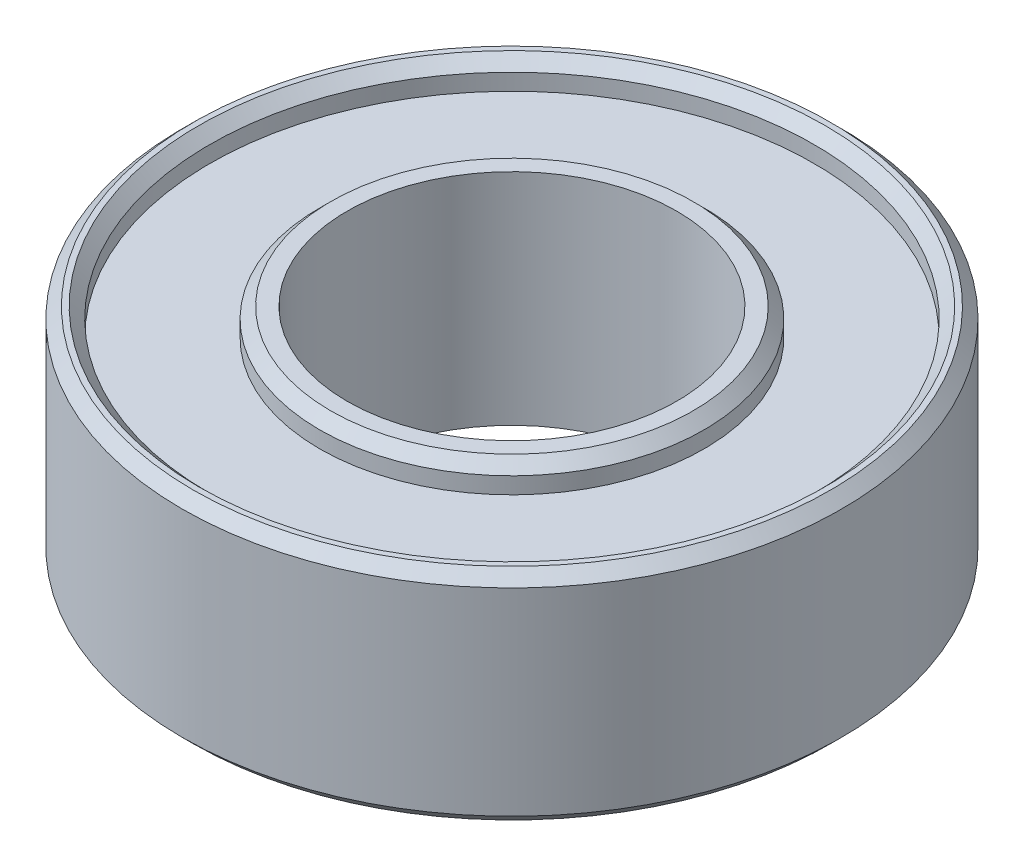
ISO-10303-21;
HEADER;
FILE_DESCRIPTION(('STEP AP214'),'2;1');
FILE_NAME('part.step','',(''),(''),'','','');
FILE_SCHEMA(('AUTOMOTIVE_DESIGN { 1 0 10303 214 1 1 1 1 }'));
ENDSEC;
DATA;
#1=APPLICATION_CONTEXT('core data for automotive mechanical design processes');
#2=APPLICATION_PROTOCOL_DEFINITION('international standard','automotive_design',2000,#1);
#3=PRODUCT_CONTEXT('',#1,'mechanical');
#4=PRODUCT('Part','Part','',(#3));
#5=PRODUCT_RELATED_PRODUCT_CATEGORY('part','',(#4));
#6=PRODUCT_DEFINITION_FORMATION('','',#4);
#7=PRODUCT_DEFINITION_CONTEXT('part definition',#1,'design');
#8=PRODUCT_DEFINITION('design','',#6,#7);
#9=PRODUCT_DEFINITION_SHAPE('','',#8);
#10=(LENGTH_UNIT() NAMED_UNIT(*) SI_UNIT(.MILLI.,.METRE.));
#11=(NAMED_UNIT(*) PLANE_ANGLE_UNIT() SI_UNIT($,.RADIAN.));
#12=(NAMED_UNIT(*) SI_UNIT($,.STERADIAN.) SOLID_ANGLE_UNIT());
#13=UNCERTAINTY_MEASURE_WITH_UNIT(LENGTH_MEASURE(1.E-05),#10,'distance_accuracy_value','');
#14=(GEOMETRIC_REPRESENTATION_CONTEXT(3) GLOBAL_UNCERTAINTY_ASSIGNED_CONTEXT((#13)) GLOBAL_UNIT_ASSIGNED_CONTEXT((#10,
#11,#12)) REPRESENTATION_CONTEXT('',''));
#15=CARTESIAN_POINT('',(0.,0.,0.));
#16=DIRECTION('',(0.,0.,1.));
#17=DIRECTION('',(1.,0.,0.));
#18=AXIS2_PLACEMENT_3D('',#15,#16,#17);
#19=CARTESIAN_POINT('',(0.,0.,0.));
#20=DIRECTION('',(0.,1.,0.));
#21=DIRECTION('',(0.,0.,1.));
#22=AXIS2_PLACEMENT_3D('',#19,#20,#21);
#23=PLANE('',#22);
#24=CARTESIAN_POINT('',(0.,0.,0.));
#25=DIRECTION('',(0.,1.,0.));
#26=DIRECTION('',(0.,0.,1.));
#27=AXIS2_PLACEMENT_3D('',#24,#25,#26);
#28=CIRCLE('',#27,1.65);
#29=CARTESIAN_POINT('',(0.,0.,1.65));
#30=VERTEX_POINT('',#29);
#31=EDGE_CURVE('E78',#30,#30,#28,.F.);
#32=ORIENTED_EDGE('',*,*,#31,.T.);
#33=EDGE_LOOP('',(#32));
#34=FACE_BOUND('',#33,.T.);
#35=CARTESIAN_POINT('',(0.,0.,0.));
#36=DIRECTION('',(0.,1.,0.));
#37=DIRECTION('',(0.,0.,1.));
#38=AXIS2_PLACEMENT_3D('',#35,#36,#37);
#39=CIRCLE('',#38,1.5);
#40=CARTESIAN_POINT('',(0.,0.,1.5));
#41=VERTEX_POINT('',#40);
#42=EDGE_CURVE('E93',#41,#41,#39,.T.);
#43=ORIENTED_EDGE('',*,*,#42,.T.);
#44=EDGE_LOOP('',(#43));
#45=FACE_BOUND('',#44,.T.);
#46=ADVANCED_FACE('F45',(#34,#45),#23,.F.);
#47=CARTESIAN_POINT('',(0.,2.,0.));
#48=DIRECTION('',(0.,1.,0.));
#49=DIRECTION('',(0.,0.,1.));
#50=AXIS2_PLACEMENT_3D('',#47,#48,#49);
#51=PLANE('',#50);
#52=CARTESIAN_POINT('',(0.,2.,0.));
#53=DIRECTION('',(0.,1.,0.));
#54=DIRECTION('',(0.,0.,1.));
#55=AXIS2_PLACEMENT_3D('',#52,#53,#54);
#56=CIRCLE('',#55,1.65);
#57=CARTESIAN_POINT('',(0.,2.,1.65));
#58=VERTEX_POINT('',#57);
#59=EDGE_CURVE('E87',#58,#58,#56,.T.);
#60=ORIENTED_EDGE('',*,*,#59,.T.);
#61=EDGE_LOOP('',(#60));
#62=FACE_BOUND('',#61,.T.);
#63=CARTESIAN_POINT('',(0.,2.,0.));
#64=DIRECTION('',(0.,1.,0.));
#65=DIRECTION('',(0.,0.,1.));
#66=AXIS2_PLACEMENT_3D('',#63,#64,#65);
#67=CIRCLE('',#66,1.5);
#68=CARTESIAN_POINT('',(0.,2.,1.5));
#69=VERTEX_POINT('',#68);
#70=EDGE_CURVE('E90',#69,#69,#67,.T.);
#71=ORIENTED_EDGE('',*,*,#70,.F.);
#72=EDGE_LOOP('',(#71));
#73=FACE_BOUND('',#72,.T.);
#74=ADVANCED_FACE('F128',(#62,#73),#51,.T.);
#75=CARTESIAN_POINT('',(0.,2.,0.));
#76=DIRECTION('',(0.,-1.,0.));
#77=DIRECTION('',(0.,0.,-1.));
#78=AXIS2_PLACEMENT_3D('',#75,#76,#77);
#79=CYLINDRICAL_SURFACE('',#78,3.);
#80=CARTESIAN_POINT('',(0.,0.0999999999999994,0.));
#81=DIRECTION('',(0.,1.,0.));
#82=DIRECTION('',(0.,0.,1.));
#83=AXIS2_PLACEMENT_3D('',#80,#81,#82);
#84=CIRCLE('',#83,3.);
#85=CARTESIAN_POINT('',(0.,0.0999999999999994,3.));
#86=VERTEX_POINT('',#85);
#87=EDGE_CURVE('E61',#86,#86,#84,.T.);
#88=ORIENTED_EDGE('',*,*,#87,.T.);
#89=EDGE_LOOP('',(#88));
#90=FACE_BOUND('',#89,.T.);
#91=CARTESIAN_POINT('',(0.,1.9,0.));
#92=DIRECTION('',(0.,1.,0.));
#93=DIRECTION('',(0.,0.,1.));
#94=AXIS2_PLACEMENT_3D('',#91,#92,#93);
#95=CIRCLE('',#94,3.);
#96=CARTESIAN_POINT('',(0.,1.9,3.));
#97=VERTEX_POINT('',#96);
#98=EDGE_CURVE('E66',#97,#97,#95,.F.);
#99=ORIENTED_EDGE('',*,*,#98,.T.);
#100=EDGE_LOOP('',(#99));
#101=FACE_BOUND('',#100,.T.);
#102=ADVANCED_FACE('F136',(#90,#101),#79,.T.);
#103=CARTESIAN_POINT('',(0.,2.,0.));
#104=DIRECTION('',(0.,1.,0.));
#105=DIRECTION('',(0.,0.,1.));
#106=AXIS2_PLACEMENT_3D('',#103,#104,#105);
#107=CIRCLE('',#106,2.9);
#108=CARTESIAN_POINT('',(0.,2.,2.9));
#109=VERTEX_POINT('',#108);
#110=EDGE_CURVE('E53',#109,#109,#107,.T.);
#111=ORIENTED_EDGE('',*,*,#110,.T.);
#112=EDGE_LOOP('',(#111));
#113=FACE_BOUND('',#112,.T.);
#114=CARTESIAN_POINT('',(0.,2.,0.));
#115=DIRECTION('',(0.,1.,0.));
#116=DIRECTION('',(0.,0.,1.));
#117=AXIS2_PLACEMENT_3D('',#114,#115,#116);
#118=CIRCLE('',#117,2.85);
#119=CARTESIAN_POINT('',(0.,2.,2.85));
#120=VERTEX_POINT('',#119);
#121=EDGE_CURVE('E57',#120,#120,#118,.F.);
#122=ORIENTED_EDGE('',*,*,#121,.T.);
#123=EDGE_LOOP('',(#122));
#124=FACE_BOUND('',#123,.T.);
#125=ADVANCED_FACE('F139',(#113,#124),#51,.T.);
#126=CARTESIAN_POINT('',(0.,0.,0.));
#127=DIRECTION('',(0.,1.,0.));
#128=DIRECTION('',(0.,0.,1.));
#129=AXIS2_PLACEMENT_3D('',#126,#127,#128);
#130=CIRCLE('',#129,2.85);
#131=CARTESIAN_POINT('',(0.,0.,-2.85));
#132=VERTEX_POINT('',#131);
#133=EDGE_CURVE('E72',#132,#132,#130,.T.);
#134=ORIENTED_EDGE('',*,*,#133,.T.);
#135=EDGE_LOOP('',(#134));
#136=FACE_BOUND('',#135,.T.);
#137=CARTESIAN_POINT('',(0.,0.,0.));
#138=DIRECTION('',(0.,1.,0.));
#139=DIRECTION('',(0.,0.,1.));
#140=AXIS2_PLACEMENT_3D('',#137,#138,#139);
#141=CIRCLE('',#140,2.9);
#142=CARTESIAN_POINT('',(0.,0.,2.9));
#143=VERTEX_POINT('',#142);
#144=EDGE_CURVE('E75',#143,#143,#141,.F.);
#145=ORIENTED_EDGE('',*,*,#144,.T.);
#146=EDGE_LOOP('',(#145));
#147=FACE_BOUND('',#146,.T.);
#148=ADVANCED_FACE('F131',(#136,#147),#23,.F.);
#149=CARTESIAN_POINT('',(0.,6.24264068711929,0.));
#150=DIRECTION('',(0.,-1.,0.));
#151=DIRECTION('',(0.,0.,-1.));
#152=AXIS2_PLACEMENT_3D('',#149,#150,#151);
#153=CYLINDRICAL_SURFACE('',#152,1.5);
#154=ORIENTED_EDGE('',*,*,#42,.F.);
#155=EDGE_LOOP('',(#154));
#156=FACE_BOUND('',#155,.T.);
#157=ORIENTED_EDGE('',*,*,#70,.T.);
#158=EDGE_LOOP('',(#157));
#159=FACE_BOUND('',#158,.T.);
#160=ADVANCED_FACE('F143',(#156,#159),#153,.F.);
#161=CARTESIAN_POINT('',(0.,1.75,0.));
#162=DIRECTION('',(0.,1.,0.));
#163=DIRECTION('',(0.,0.,1.));
#164=AXIS2_PLACEMENT_3D('',#161,#162,#163);
#165=CYLINDRICAL_SURFACE('',#164,2.75);
#166=CARTESIAN_POINT('',(0.,1.9,0.));
#167=DIRECTION('',(0.,1.,0.));
#168=DIRECTION('',(0.,0.,1.));
#169=AXIS2_PLACEMENT_3D('',#166,#167,#168);
#170=CIRCLE('',#169,2.75);
#171=CARTESIAN_POINT('',(0.,1.9,2.75));
#172=VERTEX_POINT('',#171);
#173=EDGE_CURVE('E10',#172,#172,#170,.T.);
#174=ORIENTED_EDGE('',*,*,#173,.T.);
#175=EDGE_LOOP('',(#174));
#176=FACE_BOUND('',#175,.T.);
#177=CARTESIAN_POINT('',(0.,1.75,0.));
#178=DIRECTION('',(0.,1.,0.));
#179=DIRECTION('',(0.,0.,1.));
#180=AXIS2_PLACEMENT_3D('',#177,#178,#179);
#181=CIRCLE('',#180,2.75);
#182=CARTESIAN_POINT('',(0.,1.75,2.75));
#183=VERTEX_POINT('',#182);
#184=EDGE_CURVE('E96',#183,#183,#181,.T.);
#185=ORIENTED_EDGE('',*,*,#184,.F.);
#186=EDGE_LOOP('',(#185));
#187=FACE_BOUND('',#186,.T.);
#188=ADVANCED_FACE('F150',(#176,#187),#165,.F.);
#189=CARTESIAN_POINT('',(0.,1.75,0.));
#190=DIRECTION('',(0.,1.,0.));
#191=DIRECTION('',(0.,0.,1.));
#192=AXIS2_PLACEMENT_3D('',#189,#190,#191);
#193=PLANE('',#192);
#194=CARTESIAN_POINT('',(0.,1.75,0.));
#195=DIRECTION('',(0.,1.,0.));
#196=DIRECTION('',(0.,0.,1.));
#197=AXIS2_PLACEMENT_3D('',#194,#195,#196);
#198=CIRCLE('',#197,1.75);
#199=CARTESIAN_POINT('',(0.,1.75,1.75));
#200=VERTEX_POINT('',#199);
#201=EDGE_CURVE('E99',#200,#200,#198,.T.);
#202=ORIENTED_EDGE('',*,*,#201,.F.);
#203=EDGE_LOOP('',(#202));
#204=FACE_BOUND('',#203,.T.);
#205=ORIENTED_EDGE('',*,*,#184,.T.);
#206=EDGE_LOOP('',(#205));
#207=FACE_BOUND('',#206,.T.);
#208=ADVANCED_FACE('F243',(#204,#207),#193,.T.);
#209=CARTESIAN_POINT('',(0.,1.75,0.));
#210=DIRECTION('',(0.,1.,0.));
#211=DIRECTION('',(0.,0.,1.));
#212=AXIS2_PLACEMENT_3D('',#209,#210,#211);
#213=CYLINDRICAL_SURFACE('',#212,1.75);
#214=CARTESIAN_POINT('',(0.,1.9,0.));
#215=DIRECTION('',(0.,1.,0.));
#216=DIRECTION('',(0.,0.,1.));
#217=AXIS2_PLACEMENT_3D('',#214,#215,#216);
#218=CIRCLE('',#217,1.75);
#219=CARTESIAN_POINT('',(0.,1.9,1.75));
#220=VERTEX_POINT('',#219);
#221=EDGE_CURVE('E84',#220,#220,#218,.F.);
#222=ORIENTED_EDGE('',*,*,#221,.T.);
#223=EDGE_LOOP('',(#222));
#224=FACE_BOUND('',#223,.T.);
#225=ORIENTED_EDGE('',*,*,#201,.T.);
#226=EDGE_LOOP('',(#225));
#227=FACE_BOUND('',#226,.T.);
#228=ADVANCED_FACE('F232',(#224,#227),#213,.T.);
#229=CARTESIAN_POINT('',(0.,0.25,0.));
#230=DIRECTION('',(0.,1.,0.));
#231=DIRECTION('',(0.,0.,1.));
#232=AXIS2_PLACEMENT_3D('',#229,#230,#231);
#233=PLANE('',#232);
#234=CARTESIAN_POINT('',(0.,0.25,0.));
#235=DIRECTION('',(0.,1.,0.));
#236=DIRECTION('',(0.,0.,1.));
#237=AXIS2_PLACEMENT_3D('',#234,#235,#236);
#238=CIRCLE('',#237,2.75);
#239=CARTESIAN_POINT('',(0.,0.25,2.75));
#240=VERTEX_POINT('',#239);
#241=EDGE_CURVE('E102',#240,#240,#238,.T.);
#242=ORIENTED_EDGE('',*,*,#241,.F.);
#243=EDGE_LOOP('',(#242));
#244=FACE_BOUND('',#243,.T.);
#245=CARTESIAN_POINT('',(0.,0.25,0.));
#246=DIRECTION('',(0.,1.,0.));
#247=DIRECTION('',(0.,0.,1.));
#248=AXIS2_PLACEMENT_3D('',#245,#246,#247);
#249=CIRCLE('',#248,1.75);
#250=CARTESIAN_POINT('',(0.,0.25,1.75));
#251=VERTEX_POINT('',#250);
#252=EDGE_CURVE('E105',#251,#251,#249,.T.);
#253=ORIENTED_EDGE('',*,*,#252,.T.);
#254=EDGE_LOOP('',(#253));
#255=FACE_BOUND('',#254,.T.);
#256=ADVANCED_FACE('F109',(#244,#255),#233,.F.);
#257=CARTESIAN_POINT('',(0.,0.25,0.));
#258=DIRECTION('',(0.,-1.,0.));
#259=DIRECTION('',(0.,0.,-1.));
#260=AXIS2_PLACEMENT_3D('',#257,#258,#259);
#261=CYLINDRICAL_SURFACE('',#260,2.75);
#262=CARTESIAN_POINT('',(0.,0.0999999999999998,0.));
#263=DIRECTION('',(0.,1.,0.));
#264=DIRECTION('',(0.,0.,1.));
#265=AXIS2_PLACEMENT_3D('',#262,#263,#264);
#266=CIRCLE('',#265,2.75);
#267=CARTESIAN_POINT('',(0.,0.0999999999999998,-2.75));
#268=VERTEX_POINT('',#267);
#269=EDGE_CURVE('E69',#268,#268,#266,.F.);
#270=ORIENTED_EDGE('',*,*,#269,.T.);
#271=EDGE_LOOP('',(#270));
#272=FACE_BOUND('',#271,.T.);
#273=ORIENTED_EDGE('',*,*,#241,.T.);
#274=EDGE_LOOP('',(#273));
#275=FACE_BOUND('',#274,.T.);
#276=ADVANCED_FACE('F114',(#272,#275),#261,.F.);
#277=CARTESIAN_POINT('',(0.,0.25,0.));
#278=DIRECTION('',(0.,-1.,0.));
#279=DIRECTION('',(0.,0.,-1.));
#280=AXIS2_PLACEMENT_3D('',#277,#278,#279);
#281=CYLINDRICAL_SURFACE('',#280,1.75);
#282=CARTESIAN_POINT('',(0.,0.0999999999999996,0.));
#283=DIRECTION('',(0.,1.,0.));
#284=DIRECTION('',(0.,0.,1.));
#285=AXIS2_PLACEMENT_3D('',#282,#283,#284);
#286=CIRCLE('',#285,1.75);
#287=CARTESIAN_POINT('',(0.,0.0999999999999996,1.75));
#288=VERTEX_POINT('',#287);
#289=EDGE_CURVE('E81',#288,#288,#286,.T.);
#290=ORIENTED_EDGE('',*,*,#289,.T.);
#291=EDGE_LOOP('',(#290));
#292=FACE_BOUND('',#291,.T.);
#293=ORIENTED_EDGE('',*,*,#252,.F.);
#294=EDGE_LOOP('',(#293));
#295=FACE_BOUND('',#294,.T.);
#296=ADVANCED_FACE('F111',(#292,#295),#281,.T.);
#297=CARTESIAN_POINT('',(0.,2.,0.));
#298=DIRECTION('',(0.,-1.,0.));
#299=DIRECTION('',(0.,0.,-1.));
#300=AXIS2_PLACEMENT_3D('',#297,#298,#299);
#301=CONICAL_SURFACE('',#300,1.65,0.785398163397445);
#302=ORIENTED_EDGE('',*,*,#221,.F.);
#303=EDGE_LOOP('',(#302));
#304=FACE_BOUND('',#303,.T.);
#305=ORIENTED_EDGE('',*,*,#59,.F.);
#306=EDGE_LOOP('',(#305));
#307=FACE_BOUND('',#306,.T.);
#308=ADVANCED_FACE('F113',(#304,#307),#301,.T.);
#309=CARTESIAN_POINT('',(0.,0.0999999999999996,0.));
#310=DIRECTION('',(0.,1.,0.));
#311=DIRECTION('',(0.,0.,1.));
#312=AXIS2_PLACEMENT_3D('',#309,#310,#311);
#313=CONICAL_SURFACE('',#312,1.75,0.785398163397453);
#314=CARTESIAN_POINT('',(0.,0.,1.65));
#315=CARTESIAN_POINT('',(0.,0.0010416666666666,1.65104166666667));
#316=CARTESIAN_POINT('',(0.,0.00208333333333328,1.65208333333333));
#317=CARTESIAN_POINT('',(0.,0.00416666666666664,1.65416666666667));
#318=CARTESIAN_POINT('',(0.,0.00520833333333332,1.65520833333333));
#319=CARTESIAN_POINT('',(0.,0.00729166666666664,1.65729166666667));
#320=CARTESIAN_POINT('',(0.,0.00833333333333327,1.65833333333333));
#321=CARTESIAN_POINT('',(0.,0.0104166666666666,1.66041666666667));
#322=CARTESIAN_POINT('',(0.,0.0114583333333333,1.66145833333333));
#323=CARTESIAN_POINT('',(0.,0.0135416666666666,1.66354166666667));
#324=CARTESIAN_POINT('',(0.,0.0145833333333333,1.66458333333333));
#325=CARTESIAN_POINT('',(0.,0.0166666666666666,1.66666666666667));
#326=CARTESIAN_POINT('',(0.,0.0177083333333333,1.66770833333333));
#327=CARTESIAN_POINT('',(0.,0.0197916666666666,1.66979166666667));
#328=CARTESIAN_POINT('',(0.,0.0208333333333332,1.67083333333333));
#329=CARTESIAN_POINT('',(0.,0.0229166666666666,1.67291666666667));
#330=CARTESIAN_POINT('',(0.,0.0239583333333332,1.67395833333333));
#331=CARTESIAN_POINT('',(0.,0.0260416666666666,1.67604166666667));
#332=CARTESIAN_POINT('',(0.,0.0270833333333332,1.67708333333333));
#333=CARTESIAN_POINT('',(0.,0.0291666666666665,1.67916666666667));
#334=CARTESIAN_POINT('',(0.,0.0302083333333332,1.68020833333333));
#335=CARTESIAN_POINT('',(0.,0.0322916666666666,1.68229166666667));
#336=CARTESIAN_POINT('',(0.,0.0333333333333332,1.68333333333333));
#337=CARTESIAN_POINT('',(0.,0.0354166666666665,1.68541666666667));
#338=CARTESIAN_POINT('',(0.,0.0364583333333332,1.68645833333333));
#339=CARTESIAN_POINT('',(0.,0.0385416666666665,1.68854166666667));
#340=CARTESIAN_POINT('',(0.,0.0395833333333332,1.68958333333333));
#341=CARTESIAN_POINT('',(0.,0.0416666666666665,1.69166666666667));
#342=CARTESIAN_POINT('',(0.,0.0427083333333332,1.69270833333333));
#343=CARTESIAN_POINT('',(0.,0.0447916666666665,1.69479166666667));
#344=CARTESIAN_POINT('',(0.,0.0458333333333331,1.69583333333333));
#345=CARTESIAN_POINT('',(0.,0.0479166666666665,1.69791666666667));
#346=CARTESIAN_POINT('',(0.,0.0489583333333331,1.69895833333333));
#347=CARTESIAN_POINT('',(0.,0.0510416666666665,1.70104166666667));
#348=CARTESIAN_POINT('',(0.,0.0520833333333331,1.70208333333333));
#349=CARTESIAN_POINT('',(0.,0.0541666666666664,1.70416666666667));
#350=CARTESIAN_POINT('',(0.,0.0552083333333331,1.70520833333333));
#351=CARTESIAN_POINT('',(0.,0.0572916666666664,1.70729166666667));
#352=CARTESIAN_POINT('',(0.,0.0583333333333331,1.70833333333333));
#353=CARTESIAN_POINT('',(0.,0.0604166666666665,1.71041666666667));
#354=CARTESIAN_POINT('',(0.,0.0614583333333331,1.71145833333333));
#355=CARTESIAN_POINT('',(0.,0.0635416666666664,1.71354166666667));
#356=CARTESIAN_POINT('',(0.,0.064583333333333,1.71458333333333));
#357=CARTESIAN_POINT('',(0.,0.0666666666666664,1.71666666666667));
#358=CARTESIAN_POINT('',(0.,0.0677083333333331,1.71770833333333));
#359=CARTESIAN_POINT('',(0.,0.0697916666666664,1.71979166666667));
#360=CARTESIAN_POINT('',(0.,0.0708333333333331,1.72083333333333));
#361=CARTESIAN_POINT('',(0.,0.0729166666666664,1.72291666666667));
#362=CARTESIAN_POINT('',(0.,0.073958333333333,1.72395833333333));
#363=CARTESIAN_POINT('',(0.,0.0760416666666663,1.72604166666667));
#364=CARTESIAN_POINT('',(0.,0.077083333333333,1.72708333333333));
#365=CARTESIAN_POINT('',(0.,0.0791666666666664,1.72916666666667));
#366=CARTESIAN_POINT('',(0.,0.080208333333333,1.73020833333333));
#367=CARTESIAN_POINT('',(0.,0.0822916666666663,1.73229166666667));
#368=CARTESIAN_POINT('',(0.,0.083333333333333,1.73333333333333));
#369=CARTESIAN_POINT('',(0.,0.0854166666666663,1.73541666666667));
#370=CARTESIAN_POINT('',(0.,0.086458333333333,1.73645833333333));
#371=CARTESIAN_POINT('',(0.,0.0885416666666663,1.73854166666667));
#372=CARTESIAN_POINT('',(0.,0.089583333333333,1.73958333333333));
#373=CARTESIAN_POINT('',(0.,0.0916666666666663,1.74166666666667));
#374=CARTESIAN_POINT('',(0.,0.0927083333333329,1.74270833333333));
#375=CARTESIAN_POINT('',(0.,0.0947916666666663,1.74479166666667));
#376=CARTESIAN_POINT('',(0.,0.0958333333333329,1.74583333333333));
#377=CARTESIAN_POINT('',(0.,0.0979166666666663,1.74791666666667));
#378=CARTESIAN_POINT('',(0.,0.098958333333333,1.74895833333333));
#379=CARTESIAN_POINT('',(0.,0.0999999999999996,1.75));
#380=B_SPLINE_CURVE_WITH_KNOTS('',3,(#314,#315,#316,#317,#318,#319,#320,#321,#322,#323,#324,
#325,#326,#327,#328,#329,#330,#331,#332,#333,#334,#335,#336,#337,#338,#339,#340,#341,#342,#343,
#344,#345,#346,#347,#348,#349,#350,#351,#352,#353,#354,#355,#356,#357,#358,#359,#360,#361,#362,
#363,#364,#365,#366,#367,#368,#369,#370,#371,#372,#373,#374,#375,#376,#377,#378,#379),
.UNSPECIFIED.,.F.,.F.,(4,2,2,2,2,2,2,2,2,2,2,2,2,2,2,2,2,2,2,2,2,2,2,2,2,2,2,2,2,2,2,2,4),(0.,
0.00441941738241598,0.0088388347648318,0.0132582521472478,0.0176776695296636,0.0220970869120796,
0.0265165042944956,0.0309359216769115,0.0353553390593274,0.0397747564417433,0.0441941738241592,
0.0486135912065751,0.0530330085889911,0.0574524259714069,0.0618718433538229,0.0662912607362389,
0.0707106781186547,0.0751300955010707,0.0795495128834867,0.0839689302659025,0.0883883476483185,
0.0928077650307344,0.0972271824131503,0.101646599795566,0.106066017177982,0.110485434560398,
0.114904851942814,0.11932426932523,0.123743686707646,0.128163104090062,0.132582521472478,
0.137001938854894,0.14142135623731),.UNSPECIFIED.);
#381=EDGE_CURVE('BSEAM121',#30,#288,#380,.T.);
#382=ORIENTED_EDGE('',*,*,#31,.F.);
#383=ORIENTED_EDGE('',*,*,#289,.F.);
#384=ORIENTED_EDGE('',*,*,#381,.T.);
#385=ORIENTED_EDGE('',*,*,#381,.F.);
#386=EDGE_LOOP('',(#382,#384,#383,#385));
#387=FACE_BOUND('',#386,.T.);
#388=ADVANCED_FACE('F121',(#387),#313,.T.);
#389=CARTESIAN_POINT('',(0.,0.,0.));
#390=DIRECTION('',(0.,-1.,0.));
#391=DIRECTION('',(0.,0.,-1.));
#392=AXIS2_PLACEMENT_3D('',#389,#390,#391);
#393=CONICAL_SURFACE('',#392,2.85,0.785398163397448);
#394=CARTESIAN_POINT('',(0.,0.0999999999999998,-2.75));
#395=CARTESIAN_POINT('',(0.,0.0989583333333331,-2.75104166666667));
#396=CARTESIAN_POINT('',(0.,0.0979166666666665,-2.75208333333333));
#397=CARTESIAN_POINT('',(0.,0.0958333333333332,-2.75416666666667));
#398=CARTESIAN_POINT('',(0.,0.0947916666666665,-2.75520833333333));
#399=CARTESIAN_POINT('',(0.,0.0927083333333332,-2.75729166666667));
#400=CARTESIAN_POINT('',(0.,0.0916666666666665,-2.75833333333333));
#401=CARTESIAN_POINT('',(0.,0.0895833333333331,-2.76041666666667));
#402=CARTESIAN_POINT('',(0.,0.0885416666666665,-2.76145833333333));
#403=CARTESIAN_POINT('',(0.,0.0864583333333332,-2.76354166666667));
#404=CARTESIAN_POINT('',(0.,0.0854166666666665,-2.76458333333333));
#405=CARTESIAN_POINT('',(0.,0.0833333333333332,-2.76666666666667));
#406=CARTESIAN_POINT('',(0.,0.0822916666666666,-2.76770833333333));
#407=CARTESIAN_POINT('',(0.,0.0802083333333332,-2.76979166666667));
#408=CARTESIAN_POINT('',(0.,0.0791666666666665,-2.77083333333333));
#409=CARTESIAN_POINT('',(0.,0.0770833333333331,-2.77291666666667));
#410=CARTESIAN_POINT('',(0.,0.0760416666666665,-2.77395833333333));
#411=CARTESIAN_POINT('',(0.,0.0739583333333332,-2.77604166666667));
#412=CARTESIAN_POINT('',(0.,0.0729166666666665,-2.77708333333333));
#413=CARTESIAN_POINT('',(0.,0.0708333333333332,-2.77916666666667));
#414=CARTESIAN_POINT('',(0.,0.0697916666666665,-2.78020833333333));
#415=CARTESIAN_POINT('',(0.,0.0677083333333332,-2.78229166666667));
#416=CARTESIAN_POINT('',(0.,0.0666666666666666,-2.78333333333333));
#417=CARTESIAN_POINT('',(0.,0.0645833333333332,-2.78541666666667));
#418=CARTESIAN_POINT('',(0.,0.0635416666666665,-2.78645833333333));
#419=CARTESIAN_POINT('',(0.,0.0614583333333332,-2.78854166666667));
#420=CARTESIAN_POINT('',(0.,0.0604166666666665,-2.78958333333333));
#421=CARTESIAN_POINT('',(0.,0.0583333333333332,-2.79166666666667));
#422=CARTESIAN_POINT('',(0.,0.0572916666666666,-2.79270833333333));
#423=CARTESIAN_POINT('',(0.,0.0552083333333332,-2.79479166666667));
#424=CARTESIAN_POINT('',(0.,0.0541666666666666,-2.79583333333333));
#425=CARTESIAN_POINT('',(0.,0.0520833333333333,-2.79791666666667));
#426=CARTESIAN_POINT('',(0.,0.0510416666666665,-2.79895833333333));
#427=CARTESIAN_POINT('',(0.,0.0489583333333332,-2.80104166666667));
#428=CARTESIAN_POINT('',(0.,0.0479166666666666,-2.80208333333333));
#429=CARTESIAN_POINT('',(0.,0.0458333333333333,-2.80416666666667));
#430=CARTESIAN_POINT('',(0.,0.0447916666666666,-2.80520833333333));
#431=CARTESIAN_POINT('',(0.,0.0427083333333332,-2.80729166666667));
#432=CARTESIAN_POINT('',(0.,0.0416666666666666,-2.80833333333333));
#433=CARTESIAN_POINT('',(0.,0.0395833333333333,-2.81041666666667));
#434=CARTESIAN_POINT('',(0.,0.0385416666666666,-2.81145833333333));
#435=CARTESIAN_POINT('',(0.,0.0364583333333333,-2.81354166666667));
#436=CARTESIAN_POINT('',(0.,0.0354166666666666,-2.81458333333333));
#437=CARTESIAN_POINT('',(0.,0.0333333333333332,-2.81666666666667));
#438=CARTESIAN_POINT('',(0.,0.0322916666666666,-2.81770833333333));
#439=CARTESIAN_POINT('',(0.,0.0302083333333333,-2.81979166666667));
#440=CARTESIAN_POINT('',(0.,0.0291666666666666,-2.82083333333333));
#441=CARTESIAN_POINT('',(0.,0.0270833333333333,-2.82291666666667));
#442=CARTESIAN_POINT('',(0.,0.0260416666666666,-2.82395833333333));
#443=CARTESIAN_POINT('',(0.,0.0239583333333333,-2.82604166666667));
#444=CARTESIAN_POINT('',(0.,0.0229166666666667,-2.82708333333333));
#445=CARTESIAN_POINT('',(0.,0.0208333333333333,-2.82916666666667));
#446=CARTESIAN_POINT('',(0.,0.0197916666666666,-2.83020833333333));
#447=CARTESIAN_POINT('',(0.,0.0177083333333333,-2.83229166666667));
#448=CARTESIAN_POINT('',(0.,0.0166666666666666,-2.83333333333333));
#449=CARTESIAN_POINT('',(0.,0.0145833333333333,-2.83541666666667));
#450=CARTESIAN_POINT('',(0.,0.0135416666666666,-2.83645833333333));
#451=CARTESIAN_POINT('',(0.,0.0114583333333333,-2.83854166666667));
#452=CARTESIAN_POINT('',(0.,0.0104166666666667,-2.83958333333333));
#453=CARTESIAN_POINT('',(0.,0.00833333333333335,-2.84166666666667));
#454=CARTESIAN_POINT('',(0.,0.00729166666666663,-2.84270833333333));
#455=CARTESIAN_POINT('',(0.,0.00520833333333327,-2.84479166666667));
#456=CARTESIAN_POINT('',(0.,0.00416666666666663,-2.84583333333333));
#457=CARTESIAN_POINT('',(0.,0.00208333333333335,-2.84791666666667));
#458=CARTESIAN_POINT('',(0.,0.00104166666666672,-2.84895833333333));
#459=CARTESIAN_POINT('',(0.,0.,-2.85));
#460=B_SPLINE_CURVE_WITH_KNOTS('',3,(#394,#395,#396,#397,#398,#399,#400,#401,#402,#403,#404,
#405,#406,#407,#408,#409,#410,#411,#412,#413,#414,#415,#416,#417,#418,#419,#420,#421,#422,#423,
#424,#425,#426,#427,#428,#429,#430,#431,#432,#433,#434,#435,#436,#437,#438,#439,#440,#441,#442,
#443,#444,#445,#446,#447,#448,#449,#450,#451,#452,#453,#454,#455,#456,#457,#458,#459),
.UNSPECIFIED.,.F.,.F.,(4,2,2,2,2,2,2,2,2,2,2,2,2,2,2,2,2,2,2,2,2,2,2,2,2,2,2,2,2,2,2,2,4),(0.,
0.00441941738241598,0.00883883476483196,0.0132582521472476,0.0176776695296636,
0.0220970869120796,0.0265165042944956,0.0309359216769113,0.0353553390593272,0.0397747564417432,
0.0441941738241592,0.0486135912065752,0.0530330085889909,0.0574524259714068,0.0618718433538228,
0.0662912607362388,0.0707106781186545,0.0751300955010705,0.0795495128834864,0.0839689302659024,
0.0883883476483184,0.0928077650307341,0.0972271824131501,0.101646599795566,0.106066017177982,
0.110485434560398,0.114904851942814,0.11932426932523,0.123743686707646,0.128163104090062,
0.132582521472477,0.137001938854893,0.141421356237309),.UNSPECIFIED.);
#461=EDGE_CURVE('BSEAM161',#268,#132,#460,.T.);
#462=ORIENTED_EDGE('',*,*,#269,.F.);
#463=ORIENTED_EDGE('',*,*,#133,.F.);
#464=ORIENTED_EDGE('',*,*,#461,.T.);
#465=ORIENTED_EDGE('',*,*,#461,.F.);
#466=EDGE_LOOP('',(#462,#464,#463,#465));
#467=FACE_BOUND('',#466,.T.);
#468=ADVANCED_FACE('F161',(#467),#393,.F.);
#469=CARTESIAN_POINT('',(0.,0.0999999999999994,0.));
#470=DIRECTION('',(0.,1.,0.));
#471=DIRECTION('',(0.,0.,1.));
#472=AXIS2_PLACEMENT_3D('',#469,#470,#471);
#473=CONICAL_SURFACE('',#472,3.,0.785398163397453);
#474=ORIENTED_EDGE('',*,*,#144,.F.);
#475=EDGE_LOOP('',(#474));
#476=FACE_BOUND('',#475,.T.);
#477=ORIENTED_EDGE('',*,*,#87,.F.);
#478=EDGE_LOOP('',(#477));
#479=FACE_BOUND('',#478,.T.);
#480=ADVANCED_FACE('F157',(#476,#479),#473,.T.);
#481=CARTESIAN_POINT('',(0.,2.,0.));
#482=DIRECTION('',(0.,-1.,0.));
#483=DIRECTION('',(0.,0.,-1.));
#484=AXIS2_PLACEMENT_3D('',#481,#482,#483);
#485=CONICAL_SURFACE('',#484,2.9,0.785398163397446);
#486=ORIENTED_EDGE('',*,*,#98,.F.);
#487=EDGE_LOOP('',(#486));
#488=FACE_BOUND('',#487,.T.);
#489=ORIENTED_EDGE('',*,*,#110,.F.);
#490=EDGE_LOOP('',(#489));
#491=FACE_BOUND('',#490,.T.);
#492=ADVANCED_FACE('F160',(#488,#491),#485,.T.);
#493=CARTESIAN_POINT('',(0.,1.9,0.));
#494=DIRECTION('',(0.,1.,0.));
#495=DIRECTION('',(0.,0.,1.));
#496=AXIS2_PLACEMENT_3D('',#493,#494,#495);
#497=CONICAL_SURFACE('',#496,2.75,0.785398163397453);
#498=ORIENTED_EDGE('',*,*,#121,.F.);
#499=EDGE_LOOP('',(#498));
#500=FACE_BOUND('',#499,.T.);
#501=ORIENTED_EDGE('',*,*,#173,.F.);
#502=EDGE_LOOP('',(#501));
#503=FACE_BOUND('',#502,.T.);
#504=ADVANCED_FACE('F48',(#500,#503),#497,.F.);
#505=CLOSED_SHELL('',(#46,#74,#102,#125,#148,#160,#188,#208,#228,#256,#276,#296,#308,#388,#468,
#480,#492,#504));
#506=MANIFOLD_SOLID_BREP('B2',#505);
#507=ADVANCED_BREP_SHAPE_REPRESENTATION('',(#18,#506),#14);
#508=SHAPE_DEFINITION_REPRESENTATION(#9,#507);
ENDSEC;
END-ISO-10303-21;
